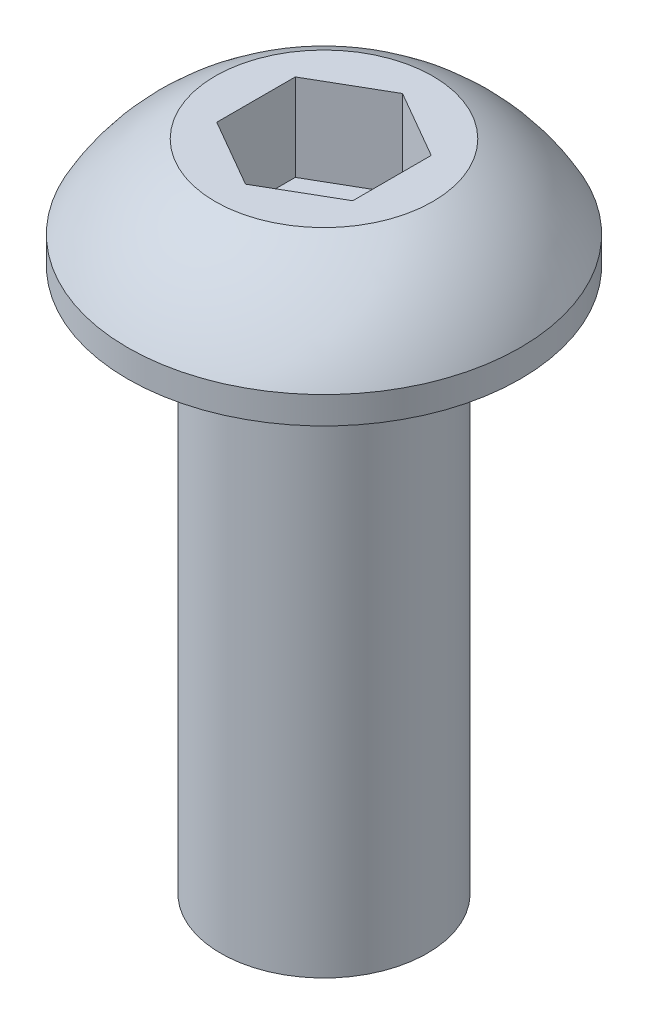
ISO-10303-21;
HEADER;
FILE_DESCRIPTION(('STEP AP214'),'2;1');
FILE_NAME('part.step','',(''),(''),'','','');
FILE_SCHEMA(('AUTOMOTIVE_DESIGN { 1 0 10303 214 1 1 1 1 }'));
ENDSEC;
DATA;
#1=APPLICATION_CONTEXT('core data for automotive mechanical design processes');
#2=APPLICATION_PROTOCOL_DEFINITION('international standard','automotive_design',2000,#1);
#3=PRODUCT_CONTEXT('',#1,'mechanical');
#4=PRODUCT('Part','Part','',(#3));
#5=PRODUCT_RELATED_PRODUCT_CATEGORY('part','',(#4));
#6=PRODUCT_DEFINITION_FORMATION('','',#4);
#7=PRODUCT_DEFINITION_CONTEXT('part definition',#1,'design');
#8=PRODUCT_DEFINITION('design','',#6,#7);
#9=PRODUCT_DEFINITION_SHAPE('','',#8);
#10=(LENGTH_UNIT() NAMED_UNIT(*) SI_UNIT(.MILLI.,.METRE.));
#11=(NAMED_UNIT(*) PLANE_ANGLE_UNIT() SI_UNIT($,.RADIAN.));
#12=(NAMED_UNIT(*) SI_UNIT($,.STERADIAN.) SOLID_ANGLE_UNIT());
#13=UNCERTAINTY_MEASURE_WITH_UNIT(LENGTH_MEASURE(1.E-05),#10,'distance_accuracy_value','');
#14=(GEOMETRIC_REPRESENTATION_CONTEXT(3) GLOBAL_UNCERTAINTY_ASSIGNED_CONTEXT((#13)) GLOBAL_UNIT_ASSIGNED_CONTEXT((#10,
#11,#12)) REPRESENTATION_CONTEXT('',''));
#15=CARTESIAN_POINT('',(0.,0.,0.));
#16=DIRECTION('',(0.,0.,1.));
#17=DIRECTION('',(1.,0.,0.));
#18=AXIS2_PLACEMENT_3D('',#15,#16,#17);
#19=CARTESIAN_POINT('',(4.5847,0.,0.));
#20=DIRECTION('',(0.,-1.,0.));
#21=DIRECTION('',(0.,0.,-1.));
#22=AXIS2_PLACEMENT_3D('',#19,#20,#21);
#23=PLANE('',#22);
#24=CARTESIAN_POINT('',(0.,0.,0.));
#25=DIRECTION('',(0.,-1.,0.));
#26=DIRECTION('',(0.,0.,-1.));
#27=AXIS2_PLACEMENT_3D('',#24,#25,#26);
#28=CIRCLE('',#27,4.5847);
#29=CARTESIAN_POINT('',(0.,0.,-4.5847));
#30=VERTEX_POINT('',#29);
#31=EDGE_CURVE('E135',#30,#30,#28,.T.);
#32=ORIENTED_EDGE('',*,*,#31,.T.);
#33=EDGE_LOOP('',(#32));
#34=FACE_BOUND('',#33,.T.);
#35=CARTESIAN_POINT('',(0.,0.,0.));
#36=DIRECTION('',(0.,-1.,0.));
#37=DIRECTION('',(0.,0.,-1.));
#38=AXIS2_PLACEMENT_3D('',#35,#36,#37);
#39=CIRCLE('',#38,2.413);
#40=CARTESIAN_POINT('',(0.,0.,-2.413));
#41=VERTEX_POINT('',#40);
#42=EDGE_CURVE('E168',#41,#41,#39,.T.);
#43=ORIENTED_EDGE('',*,*,#42,.F.);
#44=EDGE_LOOP('',(#43));
#45=FACE_BOUND('',#44,.T.);
#46=ADVANCED_FACE('F33',(#34,#45),#23,.T.);
#47=CARTESIAN_POINT('',(0.,2.5654,0.));
#48=DIRECTION('',(0.,1.,0.));
#49=DIRECTION('',(0.,0.,1.));
#50=AXIS2_PLACEMENT_3D('',#47,#48,#49);
#51=PLANE('',#50);
#52=DIRECTION('',(0.866025403784439,0.,0.5));
#53=VECTOR('',#52,1.);
#54=CARTESIAN_POINT('',(-1.5875,2.5654,0.916543552338532));
#55=LINE('',#54,#53);
#56=CARTESIAN_POINT('',(-1.5875,2.5654,0.916543552338532));
#57=VERTEX_POINT('',#56);
#58=CARTESIAN_POINT('',(0.,2.5654,1.83308710467706));
#59=VERTEX_POINT('',#58);
#60=EDGE_CURVE('E47',#57,#59,#55,.T.);
#61=ORIENTED_EDGE('',*,*,#60,.F.);
#62=DIRECTION('',(0.,0.,1.));
#63=VECTOR('',#62,1.);
#64=CARTESIAN_POINT('',(-1.5875,2.5654,-0.916543552338531));
#65=LINE('',#64,#63);
#66=CARTESIAN_POINT('',(-1.5875,2.5654,-0.916543552338531));
#67=VERTEX_POINT('',#66);
#68=EDGE_CURVE('E131',#67,#57,#65,.T.);
#69=ORIENTED_EDGE('',*,*,#68,.F.);
#70=DIRECTION('',(-0.866025403784438,0.,0.5));
#71=VECTOR('',#70,1.);
#72=CARTESIAN_POINT('',(0.,2.5654,-1.83308710467706));
#73=LINE('',#72,#71);
#74=CARTESIAN_POINT('',(0.,2.5654,-1.83308710467706));
#75=VERTEX_POINT('',#74);
#76=EDGE_CURVE('E129',#75,#67,#73,.T.);
#77=ORIENTED_EDGE('',*,*,#76,.F.);
#78=DIRECTION('',(-0.866025403784439,0.,-0.5));
#79=VECTOR('',#78,1.);
#80=CARTESIAN_POINT('',(1.5875,2.5654,-0.916543552338531));
#81=LINE('',#80,#79);
#82=CARTESIAN_POINT('',(1.5875,2.5654,-0.916543552338531));
#83=VERTEX_POINT('',#82);
#84=EDGE_CURVE('E95',#83,#75,#81,.T.);
#85=ORIENTED_EDGE('',*,*,#84,.F.);
#86=DIRECTION('',(0.,0.,-1.));
#87=VECTOR('',#86,1.);
#88=CARTESIAN_POINT('',(1.5875,2.5654,0.916543552338531));
#89=LINE('',#88,#87);
#90=CARTESIAN_POINT('',(1.5875,2.5654,0.916543552338531));
#91=VERTEX_POINT('',#90);
#92=EDGE_CURVE('E125',#91,#83,#89,.T.);
#93=ORIENTED_EDGE('',*,*,#92,.F.);
#94=DIRECTION('',(0.866025403784439,0.,-0.5));
#95=VECTOR('',#94,1.);
#96=CARTESIAN_POINT('',(0.,2.5654,1.83308710467706));
#97=LINE('',#96,#95);
#98=EDGE_CURVE('E121',#59,#91,#97,.T.);
#99=ORIENTED_EDGE('',*,*,#98,.F.);
#100=EDGE_LOOP('',(#61,#69,#77,#85,#93,#99));
#101=FACE_BOUND('',#100,.T.);
#102=CARTESIAN_POINT('',(0.,2.5654,0.));
#103=DIRECTION('',(0.,-1.,0.));
#104=DIRECTION('',(0.,0.,-1.));
#105=AXIS2_PLACEMENT_3D('',#102,#103,#104);
#106=CIRCLE('',#105,2.54);
#107=CARTESIAN_POINT('',(0.,2.5654,-2.54));
#108=VERTEX_POINT('',#107);
#109=EDGE_CURVE('E11',#108,#108,#106,.T.);
#110=ORIENTED_EDGE('',*,*,#109,.F.);
#111=EDGE_LOOP('',(#110));
#112=FACE_BOUND('',#111,.T.);
#113=ADVANCED_FACE('F150',(#101,#112),#51,.T.);
#114=CARTESIAN_POINT('',(0.,-1.56317572282556,0.));
#115=DIRECTION('',(0.,-1.,0.));
#116=DIRECTION('',(0.,0.,-1.));
#117=AXIS2_PLACEMENT_3D('',#114,#115,#116);
#118=DEGENERATE_TOROIDAL_SURFACE('',#117,0.575808944910034,4.572,.T.);
#119=ORIENTED_EDGE('',*,*,#109,.T.);
#120=EDGE_LOOP('',(#119));
#121=FACE_BOUND('',#120,.T.);
#122=CARTESIAN_POINT('',(0.,0.635,0.));
#123=DIRECTION('',(0.,-1.,0.));
#124=DIRECTION('',(0.,0.,-1.));
#125=AXIS2_PLACEMENT_3D('',#122,#123,#124);
#126=CIRCLE('',#125,4.5847);
#127=CARTESIAN_POINT('',(0.,0.635,-4.5847));
#128=VERTEX_POINT('',#127);
#129=EDGE_CURVE('E40',#128,#128,#126,.T.);
#130=ORIENTED_EDGE('',*,*,#129,.F.);
#131=EDGE_LOOP('',(#130));
#132=FACE_BOUND('',#131,.T.);
#133=ADVANCED_FACE('F148',(#121,#132),#118,.T.);
#134=CARTESIAN_POINT('',(0.,0.,0.));
#135=DIRECTION('',(0.,-1.,0.));
#136=DIRECTION('',(0.,0.,-1.));
#137=AXIS2_PLACEMENT_3D('',#134,#135,#136);
#138=CYLINDRICAL_SURFACE('',#137,4.5847);
#139=ORIENTED_EDGE('',*,*,#129,.T.);
#140=EDGE_LOOP('',(#139));
#141=FACE_BOUND('',#140,.T.);
#142=ORIENTED_EDGE('',*,*,#31,.F.);
#143=EDGE_LOOP('',(#142));
#144=FACE_BOUND('',#143,.T.);
#145=ADVANCED_FACE('F145',(#141,#144),#138,.T.);
#146=CARTESIAN_POINT('',(-1.5875,0.5334,0.916543552338532));
#147=DIRECTION('',(-0.5,0.,0.866025403784439));
#148=DIRECTION('',(0.866025403784439,0.,0.5));
#149=AXIS2_PLACEMENT_3D('',#146,#147,#148);
#150=PLANE('',#149);
#151=ORIENTED_EDGE('',*,*,#60,.T.);
#152=DIRECTION('',(0.,1.,0.));
#153=VECTOR('',#152,1.);
#154=CARTESIAN_POINT('',(0.,0.5334,1.83308710467706));
#155=LINE('',#154,#153);
#156=CARTESIAN_POINT('',(0.,0.5334,1.83308710467706));
#157=VERTEX_POINT('',#156);
#158=EDGE_CURVE('E77',#157,#59,#155,.T.);
#159=ORIENTED_EDGE('',*,*,#158,.F.);
#160=DIRECTION('',(0.866025403784439,0.,0.5));
#161=VECTOR('',#160,1.);
#162=CARTESIAN_POINT('',(-1.5875,0.5334,0.916543552338532));
#163=LINE('',#162,#161);
#164=CARTESIAN_POINT('',(-1.5875,0.5334,0.916543552338532));
#165=VERTEX_POINT('',#164);
#166=EDGE_CURVE('E133',#165,#157,#163,.T.);
#167=ORIENTED_EDGE('',*,*,#166,.F.);
#168=DIRECTION('',(0.,1.,0.));
#169=VECTOR('',#168,1.);
#170=CARTESIAN_POINT('',(-1.5875,0.5334,0.916543552338532));
#171=LINE('',#170,#169);
#172=EDGE_CURVE('E55',#165,#57,#171,.T.);
#173=ORIENTED_EDGE('',*,*,#172,.T.);
#174=EDGE_LOOP('',(#151,#159,#167,#173));
#175=FACE_BOUND('',#174,.T.);
#176=ADVANCED_FACE('F157',(#175),#150,.F.);
#177=CARTESIAN_POINT('',(-1.5875,0.5334,-0.916543552338531));
#178=DIRECTION('',(-1.,0.,0.));
#179=DIRECTION('',(0.,0.,1.));
#180=AXIS2_PLACEMENT_3D('',#177,#178,#179);
#181=PLANE('',#180);
#182=ORIENTED_EDGE('',*,*,#68,.T.);
#183=ORIENTED_EDGE('',*,*,#172,.F.);
#184=DIRECTION('',(0.,0.,1.));
#185=VECTOR('',#184,1.);
#186=CARTESIAN_POINT('',(-1.5875,0.5334,-0.916543552338531));
#187=LINE('',#186,#185);
#188=CARTESIAN_POINT('',(-1.5875,0.5334,-0.916543552338531));
#189=VERTEX_POINT('',#188);
#190=EDGE_CURVE('E107',#189,#165,#187,.T.);
#191=ORIENTED_EDGE('',*,*,#190,.F.);
#192=DIRECTION('',(0.,1.,0.));
#193=VECTOR('',#192,1.);
#194=CARTESIAN_POINT('',(-1.5875,0.5334,-0.916543552338531));
#195=LINE('',#194,#193);
#196=EDGE_CURVE('E99',#189,#67,#195,.T.);
#197=ORIENTED_EDGE('',*,*,#196,.T.);
#198=EDGE_LOOP('',(#182,#183,#191,#197));
#199=FACE_BOUND('',#198,.T.);
#200=ADVANCED_FACE('F182',(#199),#181,.F.);
#201=CARTESIAN_POINT('',(0.,0.5334,-1.83308710467706));
#202=DIRECTION('',(-0.5,0.,-0.866025403784438));
#203=DIRECTION('',(-0.866025403784439,0.,0.5));
#204=AXIS2_PLACEMENT_3D('',#201,#202,#203);
#205=PLANE('',#204);
#206=ORIENTED_EDGE('',*,*,#76,.T.);
#207=ORIENTED_EDGE('',*,*,#196,.F.);
#208=DIRECTION('',(-0.866025403784438,0.,0.5));
#209=VECTOR('',#208,1.);
#210=CARTESIAN_POINT('',(0.,0.5334,-1.83308710467706));
#211=LINE('',#210,#209);
#212=CARTESIAN_POINT('',(0.,0.5334,-1.83308710467706));
#213=VERTEX_POINT('',#212);
#214=EDGE_CURVE('E103',#213,#189,#211,.T.);
#215=ORIENTED_EDGE('',*,*,#214,.F.);
#216=DIRECTION('',(0.,1.,0.));
#217=VECTOR('',#216,1.);
#218=CARTESIAN_POINT('',(0.,0.5334,-1.83308710467706));
#219=LINE('',#218,#217);
#220=EDGE_CURVE('E88',#213,#75,#219,.T.);
#221=ORIENTED_EDGE('',*,*,#220,.T.);
#222=EDGE_LOOP('',(#206,#207,#215,#221));
#223=FACE_BOUND('',#222,.T.);
#224=ADVANCED_FACE('F104',(#223),#205,.F.);
#225=CARTESIAN_POINT('',(1.5875,0.5334,-0.916543552338531));
#226=DIRECTION('',(0.5,0.,-0.866025403784439));
#227=DIRECTION('',(-0.866025403784439,0.,-0.5));
#228=AXIS2_PLACEMENT_3D('',#225,#226,#227);
#229=PLANE('',#228);
#230=ORIENTED_EDGE('',*,*,#84,.T.);
#231=ORIENTED_EDGE('',*,*,#220,.F.);
#232=DIRECTION('',(-0.866025403784439,0.,-0.5));
#233=VECTOR('',#232,1.);
#234=CARTESIAN_POINT('',(1.5875,0.5334,-0.916543552338531));
#235=LINE('',#234,#233);
#236=CARTESIAN_POINT('',(1.5875,0.5334,-0.916543552338531));
#237=VERTEX_POINT('',#236);
#238=EDGE_CURVE('E92',#237,#213,#235,.T.);
#239=ORIENTED_EDGE('',*,*,#238,.F.);
#240=DIRECTION('',(0.,1.,0.));
#241=VECTOR('',#240,1.);
#242=CARTESIAN_POINT('',(1.5875,0.5334,-0.916543552338531));
#243=LINE('',#242,#241);
#244=EDGE_CURVE('E100',#237,#83,#243,.T.);
#245=ORIENTED_EDGE('',*,*,#244,.T.);
#246=EDGE_LOOP('',(#230,#231,#239,#245));
#247=FACE_BOUND('',#246,.T.);
#248=ADVANCED_FACE('F90',(#247),#229,.F.);
#249=CARTESIAN_POINT('',(1.5875,0.5334,0.916543552338531));
#250=DIRECTION('',(1.,0.,0.));
#251=DIRECTION('',(0.,0.,-1.));
#252=AXIS2_PLACEMENT_3D('',#249,#250,#251);
#253=PLANE('',#252);
#254=ORIENTED_EDGE('',*,*,#92,.T.);
#255=ORIENTED_EDGE('',*,*,#244,.F.);
#256=DIRECTION('',(0.,0.,-1.));
#257=VECTOR('',#256,1.);
#258=CARTESIAN_POINT('',(1.5875,0.5334,0.916543552338531));
#259=LINE('',#258,#257);
#260=CARTESIAN_POINT('',(1.5875,0.5334,0.916543552338531));
#261=VERTEX_POINT('',#260);
#262=EDGE_CURVE('E113',#261,#237,#259,.T.);
#263=ORIENTED_EDGE('',*,*,#262,.F.);
#264=DIRECTION('',(0.,1.,0.));
#265=VECTOR('',#264,1.);
#266=CARTESIAN_POINT('',(1.5875,0.5334,0.916543552338531));
#267=LINE('',#266,#265);
#268=EDGE_CURVE('E138',#261,#91,#267,.T.);
#269=ORIENTED_EDGE('',*,*,#268,.T.);
#270=EDGE_LOOP('',(#254,#255,#263,#269));
#271=FACE_BOUND('',#270,.T.);
#272=ADVANCED_FACE('F179',(#271),#253,.F.);
#273=CARTESIAN_POINT('',(0.,0.5334,1.83308710467706));
#274=DIRECTION('',(0.5,0.,0.866025403784439));
#275=DIRECTION('',(0.866025403784439,0.,-0.5));
#276=AXIS2_PLACEMENT_3D('',#273,#274,#275);
#277=PLANE('',#276);
#278=ORIENTED_EDGE('',*,*,#98,.T.);
#279=ORIENTED_EDGE('',*,*,#268,.F.);
#280=DIRECTION('',(0.866025403784439,0.,-0.5));
#281=VECTOR('',#280,1.);
#282=CARTESIAN_POINT('',(0.,0.5334,1.83308710467706));
#283=LINE('',#282,#281);
#284=EDGE_CURVE('E115',#157,#261,#283,.T.);
#285=ORIENTED_EDGE('',*,*,#284,.F.);
#286=ORIENTED_EDGE('',*,*,#158,.T.);
#287=EDGE_LOOP('',(#278,#279,#285,#286));
#288=FACE_BOUND('',#287,.T.);
#289=ADVANCED_FACE('F175',(#288),#277,.F.);
#290=CARTESIAN_POINT('',(-3.175,0.5334,0.));
#291=DIRECTION('',(0.,-1.,0.));
#292=DIRECTION('',(0.,0.,-1.));
#293=AXIS2_PLACEMENT_3D('',#290,#291,#292);
#294=PLANE('',#293);
#295=ORIENTED_EDGE('',*,*,#166,.T.);
#296=ORIENTED_EDGE('',*,*,#284,.T.);
#297=ORIENTED_EDGE('',*,*,#262,.T.);
#298=ORIENTED_EDGE('',*,*,#238,.T.);
#299=ORIENTED_EDGE('',*,*,#214,.T.);
#300=ORIENTED_EDGE('',*,*,#190,.T.);
#301=EDGE_LOOP('',(#295,#296,#297,#298,#299,#300));
#302=FACE_BOUND('',#301,.T.);
#303=ADVANCED_FACE('F110',(#302),#294,.F.);
#304=CARTESIAN_POINT('',(0.,-12.7,0.));
#305=DIRECTION('',(0.,1.,0.));
#306=DIRECTION('',(0.,0.,1.));
#307=AXIS2_PLACEMENT_3D('',#304,#305,#306);
#308=CYLINDRICAL_SURFACE('',#307,2.413);
#309=CARTESIAN_POINT('',(0.,-12.7,0.));
#310=DIRECTION('',(0.,-1.,0.));
#311=DIRECTION('',(0.,0.,-1.));
#312=AXIS2_PLACEMENT_3D('',#309,#310,#311);
#313=CIRCLE('',#312,2.413);
#314=CARTESIAN_POINT('',(0.,-12.7,-2.413));
#315=VERTEX_POINT('',#314);
#316=EDGE_CURVE('E122',#315,#315,#313,.T.);
#317=ORIENTED_EDGE('',*,*,#316,.F.);
#318=EDGE_LOOP('',(#317));
#319=FACE_BOUND('',#318,.T.);
#320=ORIENTED_EDGE('',*,*,#42,.T.);
#321=EDGE_LOOP('',(#320));
#322=FACE_BOUND('',#321,.T.);
#323=ADVANCED_FACE('F202',(#319,#322),#308,.T.);
#324=CARTESIAN_POINT('',(0.,-12.7,0.));
#325=DIRECTION('',(0.,-1.,0.));
#326=DIRECTION('',(0.,0.,-1.));
#327=AXIS2_PLACEMENT_3D('',#324,#325,#326);
#328=PLANE('',#327);
#329=ORIENTED_EDGE('',*,*,#316,.T.);
#330=EDGE_LOOP('',(#329));
#331=FACE_BOUND('',#330,.T.);
#332=ADVANCED_FACE('F206',(#331),#328,.T.);
#333=CLOSED_SHELL('',(#46,#113,#133,#145,#176,#200,#224,#248,#272,#289,#303,#323,#332));
#334=MANIFOLD_SOLID_BREP('B2',#333);
#335=ADVANCED_BREP_SHAPE_REPRESENTATION('',(#18,#334),#14);
#336=SHAPE_DEFINITION_REPRESENTATION(#9,#335);
ENDSEC;
END-ISO-10303-21;
